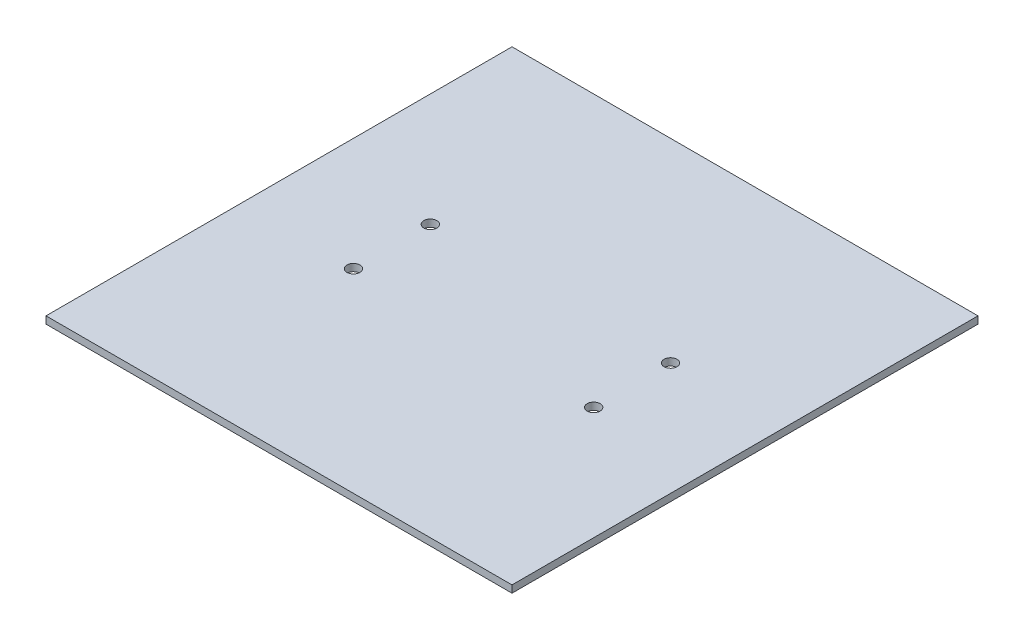
ISO-10303-21;
HEADER;
FILE_DESCRIPTION(('STEP AP214'),'2;1');
FILE_NAME('part.step','',(''),(''),'','','');
FILE_SCHEMA(('AUTOMOTIVE_DESIGN { 1 0 10303 214 1 1 1 1 }'));
ENDSEC;
DATA;
#1=APPLICATION_CONTEXT('core data for automotive mechanical design processes');
#2=APPLICATION_PROTOCOL_DEFINITION('international standard','automotive_design',2000,#1);
#3=PRODUCT_CONTEXT('',#1,'mechanical');
#4=PRODUCT('Part','Part','',(#3));
#5=PRODUCT_RELATED_PRODUCT_CATEGORY('part','',(#4));
#6=PRODUCT_DEFINITION_FORMATION('','',#4);
#7=PRODUCT_DEFINITION_CONTEXT('part definition',#1,'design');
#8=PRODUCT_DEFINITION('design','',#6,#7);
#9=PRODUCT_DEFINITION_SHAPE('','',#8);
#10=(LENGTH_UNIT() NAMED_UNIT(*) SI_UNIT(.MILLI.,.METRE.));
#11=(NAMED_UNIT(*) PLANE_ANGLE_UNIT() SI_UNIT($,.RADIAN.));
#12=(NAMED_UNIT(*) SI_UNIT($,.STERADIAN.) SOLID_ANGLE_UNIT());
#13=UNCERTAINTY_MEASURE_WITH_UNIT(LENGTH_MEASURE(1.E-05),#10,'distance_accuracy_value','');
#14=(GEOMETRIC_REPRESENTATION_CONTEXT(3) GLOBAL_UNCERTAINTY_ASSIGNED_CONTEXT((#13)) GLOBAL_UNIT_ASSIGNED_CONTEXT((#10,
#11,#12)) REPRESENTATION_CONTEXT('',''));
#15=CARTESIAN_POINT('',(0.,0.,0.));
#16=DIRECTION('',(0.,0.,1.));
#17=DIRECTION('',(1.,0.,0.));
#18=AXIS2_PLACEMENT_3D('',#15,#16,#17);
#19=CARTESIAN_POINT('',(0.,3.,0.));
#20=DIRECTION('',(0.,1.,0.));
#21=DIRECTION('',(0.,0.,1.));
#22=AXIS2_PLACEMENT_3D('',#19,#20,#21);
#23=PLANE('',#22);
#24=CARTESIAN_POINT('',(-50.,3.,16.));
#25=DIRECTION('',(0.,1.,0.));
#26=DIRECTION('',(0.,0.,-1.));
#27=AXIS2_PLACEMENT_3D('',#24,#25,#26);
#28=CIRCLE('',#27,2.69500000000001);
#29=CARTESIAN_POINT('',(-50.,3.,13.305));
#30=VERTEX_POINT('',#29);
#31=EDGE_CURVE('E123',#30,#30,#28,.T.);
#32=ORIENTED_EDGE('',*,*,#31,.F.);
#33=EDGE_LOOP('',(#32));
#34=FACE_BOUND('',#33,.T.);
#35=CARTESIAN_POINT('',(50.,3.,-16.));
#36=DIRECTION('',(0.,1.,0.));
#37=DIRECTION('',(0.,0.,1.));
#38=AXIS2_PLACEMENT_3D('',#35,#36,#37);
#39=CIRCLE('',#38,2.69500000000001);
#40=CARTESIAN_POINT('',(50.,3.,-13.305));
#41=VERTEX_POINT('',#40);
#42=EDGE_CURVE('E102',#41,#41,#39,.T.);
#43=ORIENTED_EDGE('',*,*,#42,.F.);
#44=EDGE_LOOP('',(#43));
#45=FACE_BOUND('',#44,.T.);
#46=DIRECTION('',(0.,0.,1.));
#47=VECTOR('',#46,1.);
#48=CARTESIAN_POINT('',(-97.,3.,-97.));
#49=LINE('',#48,#47);
#50=CARTESIAN_POINT('',(-97.,3.,-97.));
#51=VERTEX_POINT('',#50);
#52=CARTESIAN_POINT('',(-97.,3.,97.));
#53=VERTEX_POINT('',#52);
#54=EDGE_CURVE('E87',#51,#53,#49,.T.);
#55=ORIENTED_EDGE('',*,*,#54,.T.);
#56=DIRECTION('',(1.,0.,0.));
#57=VECTOR('',#56,1.);
#58=CARTESIAN_POINT('',(-97.,3.,97.));
#59=LINE('',#58,#57);
#60=CARTESIAN_POINT('',(97.,3.,97.));
#61=VERTEX_POINT('',#60);
#62=EDGE_CURVE('E82',#53,#61,#59,.T.);
#63=ORIENTED_EDGE('',*,*,#62,.T.);
#64=DIRECTION('',(0.,0.,-1.));
#65=VECTOR('',#64,1.);
#66=CARTESIAN_POINT('',(97.,3.,-97.));
#67=LINE('',#66,#65);
#68=CARTESIAN_POINT('',(97.,3.,-97.));
#69=VERTEX_POINT('',#68);
#70=EDGE_CURVE('E85',#61,#69,#67,.T.);
#71=ORIENTED_EDGE('',*,*,#70,.T.);
#72=DIRECTION('',(-1.,0.,0.));
#73=VECTOR('',#72,1.);
#74=CARTESIAN_POINT('',(-97.,3.,-97.));
#75=LINE('',#74,#73);
#76=EDGE_CURVE('E52',#69,#51,#75,.T.);
#77=ORIENTED_EDGE('',*,*,#76,.T.);
#78=EDGE_LOOP('',(#55,#63,#71,#77));
#79=FACE_BOUND('',#78,.T.);
#80=CARTESIAN_POINT('',(50.,3.,16.));
#81=DIRECTION('',(0.,1.,0.));
#82=DIRECTION('',(0.,0.,1.));
#83=AXIS2_PLACEMENT_3D('',#80,#81,#82);
#84=CIRCLE('',#83,2.69499999999999);
#85=CARTESIAN_POINT('',(50.,3.,18.695));
#86=VERTEX_POINT('',#85);
#87=EDGE_CURVE('E117',#86,#86,#84,.T.);
#88=ORIENTED_EDGE('',*,*,#87,.F.);
#89=EDGE_LOOP('',(#88));
#90=FACE_BOUND('',#89,.T.);
#91=CARTESIAN_POINT('',(-50.,3.,-16.));
#92=DIRECTION('',(0.,1.,0.));
#93=DIRECTION('',(0.,0.,-1.));
#94=AXIS2_PLACEMENT_3D('',#91,#92,#93);
#95=CIRCLE('',#94,2.69500000000001);
#96=CARTESIAN_POINT('',(-50.,3.,-18.695));
#97=VERTEX_POINT('',#96);
#98=EDGE_CURVE('E129',#97,#97,#95,.T.);
#99=ORIENTED_EDGE('',*,*,#98,.F.);
#100=EDGE_LOOP('',(#99));
#101=FACE_BOUND('',#100,.T.);
#102=ADVANCED_FACE('F35',(#34,#45,#79,#90,#101),#23,.T.);
#103=CARTESIAN_POINT('',(0.,0.,0.));
#104=DIRECTION('',(0.,1.,0.));
#105=DIRECTION('',(0.,0.,1.));
#106=AXIS2_PLACEMENT_3D('',#103,#104,#105);
#107=PLANE('',#106);
#108=DIRECTION('',(0.,0.,1.));
#109=VECTOR('',#108,1.);
#110=CARTESIAN_POINT('',(-97.,0.,-97.));
#111=LINE('',#110,#109);
#112=CARTESIAN_POINT('',(-97.,0.,-97.));
#113=VERTEX_POINT('',#112);
#114=CARTESIAN_POINT('',(-97.,0.,97.));
#115=VERTEX_POINT('',#114);
#116=EDGE_CURVE('E99',#113,#115,#111,.T.);
#117=ORIENTED_EDGE('',*,*,#116,.F.);
#118=DIRECTION('',(-1.,0.,0.));
#119=VECTOR('',#118,1.);
#120=CARTESIAN_POINT('',(-97.,0.,-97.));
#121=LINE('',#120,#119);
#122=CARTESIAN_POINT('',(97.,0.,-97.));
#123=VERTEX_POINT('',#122);
#124=EDGE_CURVE('E75',#123,#113,#121,.T.);
#125=ORIENTED_EDGE('',*,*,#124,.F.);
#126=DIRECTION('',(0.,0.,-1.));
#127=VECTOR('',#126,1.);
#128=CARTESIAN_POINT('',(97.,0.,-97.));
#129=LINE('',#128,#127);
#130=CARTESIAN_POINT('',(97.,0.,97.));
#131=VERTEX_POINT('',#130);
#132=EDGE_CURVE('E69',#131,#123,#129,.T.);
#133=ORIENTED_EDGE('',*,*,#132,.F.);
#134=DIRECTION('',(1.,0.,0.));
#135=VECTOR('',#134,1.);
#136=CARTESIAN_POINT('',(-97.,0.,97.));
#137=LINE('',#136,#135);
#138=EDGE_CURVE('E91',#115,#131,#137,.T.);
#139=ORIENTED_EDGE('',*,*,#138,.F.);
#140=EDGE_LOOP('',(#117,#125,#133,#139));
#141=FACE_BOUND('',#140,.T.);
#142=CARTESIAN_POINT('',(50.,0.,-16.));
#143=DIRECTION('',(0.,1.,0.));
#144=DIRECTION('',(0.,0.,1.));
#145=AXIS2_PLACEMENT_3D('',#142,#143,#144);
#146=CIRCLE('',#145,2.69500000000001);
#147=CARTESIAN_POINT('',(50.,0.,-13.305));
#148=VERTEX_POINT('',#147);
#149=EDGE_CURVE('E114',#148,#148,#146,.T.);
#150=ORIENTED_EDGE('',*,*,#149,.T.);
#151=EDGE_LOOP('',(#150));
#152=FACE_BOUND('',#151,.T.);
#153=CARTESIAN_POINT('',(50.,0.,16.));
#154=DIRECTION('',(0.,1.,0.));
#155=DIRECTION('',(0.,0.,1.));
#156=AXIS2_PLACEMENT_3D('',#153,#154,#155);
#157=CIRCLE('',#156,2.69499999999999);
#158=CARTESIAN_POINT('',(50.,0.,18.695));
#159=VERTEX_POINT('',#158);
#160=EDGE_CURVE('E120',#159,#159,#157,.T.);
#161=ORIENTED_EDGE('',*,*,#160,.T.);
#162=EDGE_LOOP('',(#161));
#163=FACE_BOUND('',#162,.T.);
#164=CARTESIAN_POINT('',(-50.,0.,16.));
#165=DIRECTION('',(0.,1.,0.));
#166=DIRECTION('',(0.,0.,-1.));
#167=AXIS2_PLACEMENT_3D('',#164,#165,#166);
#168=CIRCLE('',#167,2.69500000000001);
#169=CARTESIAN_POINT('',(-50.,0.,13.305));
#170=VERTEX_POINT('',#169);
#171=EDGE_CURVE('E126',#170,#170,#168,.T.);
#172=ORIENTED_EDGE('',*,*,#171,.T.);
#173=EDGE_LOOP('',(#172));
#174=FACE_BOUND('',#173,.T.);
#175=CARTESIAN_POINT('',(-50.,0.,-16.));
#176=DIRECTION('',(0.,1.,0.));
#177=DIRECTION('',(0.,0.,-1.));
#178=AXIS2_PLACEMENT_3D('',#175,#176,#177);
#179=CIRCLE('',#178,2.69500000000001);
#180=CARTESIAN_POINT('',(-50.,0.,-18.695));
#181=VERTEX_POINT('',#180);
#182=EDGE_CURVE('E132',#181,#181,#179,.T.);
#183=ORIENTED_EDGE('',*,*,#182,.T.);
#184=EDGE_LOOP('',(#183));
#185=FACE_BOUND('',#184,.T.);
#186=ADVANCED_FACE('F110',(#141,#152,#163,#174,#185),#107,.F.);
#187=CARTESIAN_POINT('',(-97.,3.,-97.));
#188=DIRECTION('',(1.,0.,0.));
#189=DIRECTION('',(0.,0.,-1.));
#190=AXIS2_PLACEMENT_3D('',#187,#188,#189);
#191=PLANE('',#190);
#192=ORIENTED_EDGE('',*,*,#116,.T.);
#193=DIRECTION('',(0.,-1.,0.));
#194=VECTOR('',#193,1.);
#195=CARTESIAN_POINT('',(-97.,3.,97.));
#196=LINE('',#195,#194);
#197=EDGE_CURVE('E11',#53,#115,#196,.T.);
#198=ORIENTED_EDGE('',*,*,#197,.F.);
#199=ORIENTED_EDGE('',*,*,#54,.F.);
#200=DIRECTION('',(0.,-1.,0.));
#201=VECTOR('',#200,1.);
#202=CARTESIAN_POINT('',(-97.,3.,-97.));
#203=LINE('',#202,#201);
#204=EDGE_CURVE('E95',#51,#113,#203,.T.);
#205=ORIENTED_EDGE('',*,*,#204,.T.);
#206=EDGE_LOOP('',(#192,#198,#199,#205));
#207=FACE_BOUND('',#206,.T.);
#208=ADVANCED_FACE('F37',(#207),#191,.F.);
#209=CARTESIAN_POINT('',(-97.,3.,97.));
#210=DIRECTION('',(0.,0.,-1.));
#211=DIRECTION('',(-1.,0.,0.));
#212=AXIS2_PLACEMENT_3D('',#209,#210,#211);
#213=PLANE('',#212);
#214=ORIENTED_EDGE('',*,*,#138,.T.);
#215=DIRECTION('',(0.,-1.,0.));
#216=VECTOR('',#215,1.);
#217=CARTESIAN_POINT('',(97.,3.,97.));
#218=LINE('',#217,#216);
#219=EDGE_CURVE('E44',#61,#131,#218,.T.);
#220=ORIENTED_EDGE('',*,*,#219,.F.);
#221=ORIENTED_EDGE('',*,*,#62,.F.);
#222=ORIENTED_EDGE('',*,*,#197,.T.);
#223=EDGE_LOOP('',(#214,#220,#221,#222));
#224=FACE_BOUND('',#223,.T.);
#225=ADVANCED_FACE('F90',(#224),#213,.F.);
#226=CARTESIAN_POINT('',(97.,3.,-97.));
#227=DIRECTION('',(-1.,0.,0.));
#228=DIRECTION('',(0.,0.,1.));
#229=AXIS2_PLACEMENT_3D('',#226,#227,#228);
#230=PLANE('',#229);
#231=ORIENTED_EDGE('',*,*,#132,.T.);
#232=DIRECTION('',(0.,-1.,0.));
#233=VECTOR('',#232,1.);
#234=CARTESIAN_POINT('',(97.,3.,-97.));
#235=LINE('',#234,#233);
#236=EDGE_CURVE('E92',#69,#123,#235,.T.);
#237=ORIENTED_EDGE('',*,*,#236,.F.);
#238=ORIENTED_EDGE('',*,*,#70,.F.);
#239=ORIENTED_EDGE('',*,*,#219,.T.);
#240=EDGE_LOOP('',(#231,#237,#238,#239));
#241=FACE_BOUND('',#240,.T.);
#242=ADVANCED_FACE('F93',(#241),#230,.F.);
#243=CARTESIAN_POINT('',(-97.,3.,-97.));
#244=DIRECTION('',(0.,0.,1.));
#245=DIRECTION('',(1.,0.,0.));
#246=AXIS2_PLACEMENT_3D('',#243,#244,#245);
#247=PLANE('',#246);
#248=ORIENTED_EDGE('',*,*,#124,.T.);
#249=ORIENTED_EDGE('',*,*,#204,.F.);
#250=ORIENTED_EDGE('',*,*,#76,.F.);
#251=ORIENTED_EDGE('',*,*,#236,.T.);
#252=EDGE_LOOP('',(#248,#249,#250,#251));
#253=FACE_BOUND('',#252,.T.);
#254=ADVANCED_FACE('F107',(#253),#247,.F.);
#255=CARTESIAN_POINT('',(50.,3.,-16.));
#256=DIRECTION('',(0.,-1.,0.));
#257=DIRECTION('',(0.,0.,-1.));
#258=AXIS2_PLACEMENT_3D('',#255,#256,#257);
#259=CYLINDRICAL_SURFACE('',#258,2.69500000000001);
#260=ORIENTED_EDGE('',*,*,#42,.T.);
#261=EDGE_LOOP('',(#260));
#262=FACE_BOUND('',#261,.T.);
#263=ORIENTED_EDGE('',*,*,#149,.F.);
#264=EDGE_LOOP('',(#263));
#265=FACE_BOUND('',#264,.T.);
#266=ADVANCED_FACE('F151',(#262,#265),#259,.F.);
#267=CARTESIAN_POINT('',(50.,3.,16.));
#268=DIRECTION('',(0.,-1.,0.));
#269=DIRECTION('',(0.,0.,-1.));
#270=AXIS2_PLACEMENT_3D('',#267,#268,#269);
#271=CYLINDRICAL_SURFACE('',#270,2.69499999999999);
#272=ORIENTED_EDGE('',*,*,#87,.T.);
#273=EDGE_LOOP('',(#272));
#274=FACE_BOUND('',#273,.T.);
#275=ORIENTED_EDGE('',*,*,#160,.F.);
#276=EDGE_LOOP('',(#275));
#277=FACE_BOUND('',#276,.T.);
#278=ADVANCED_FACE('F197',(#274,#277),#271,.F.);
#279=CARTESIAN_POINT('',(-50.,3.,16.));
#280=DIRECTION('',(0.,-1.,0.));
#281=DIRECTION('',(0.,0.,-1.));
#282=AXIS2_PLACEMENT_3D('',#279,#280,#281);
#283=CYLINDRICAL_SURFACE('',#282,2.69500000000001);
#284=ORIENTED_EDGE('',*,*,#31,.T.);
#285=EDGE_LOOP('',(#284));
#286=FACE_BOUND('',#285,.T.);
#287=ORIENTED_EDGE('',*,*,#171,.F.);
#288=EDGE_LOOP('',(#287));
#289=FACE_BOUND('',#288,.T.);
#290=ADVANCED_FACE('F205',(#286,#289),#283,.F.);
#291=CARTESIAN_POINT('',(-50.,3.,-16.));
#292=DIRECTION('',(0.,-1.,0.));
#293=DIRECTION('',(0.,0.,-1.));
#294=AXIS2_PLACEMENT_3D('',#291,#292,#293);
#295=CYLINDRICAL_SURFACE('',#294,2.69500000000001);
#296=ORIENTED_EDGE('',*,*,#98,.T.);
#297=EDGE_LOOP('',(#296));
#298=FACE_BOUND('',#297,.T.);
#299=ORIENTED_EDGE('',*,*,#182,.F.);
#300=EDGE_LOOP('',(#299));
#301=FACE_BOUND('',#300,.T.);
#302=ADVANCED_FACE('F138',(#298,#301),#295,.F.);
#303=CLOSED_SHELL('',(#102,#186,#208,#225,#242,#254,#266,#278,#290,#302));
#304=MANIFOLD_SOLID_BREP('B2',#303);
#305=ADVANCED_BREP_SHAPE_REPRESENTATION('',(#18,#304),#14);
#306=SHAPE_DEFINITION_REPRESENTATION(#9,#305);
ENDSEC;
END-ISO-10303-21;
